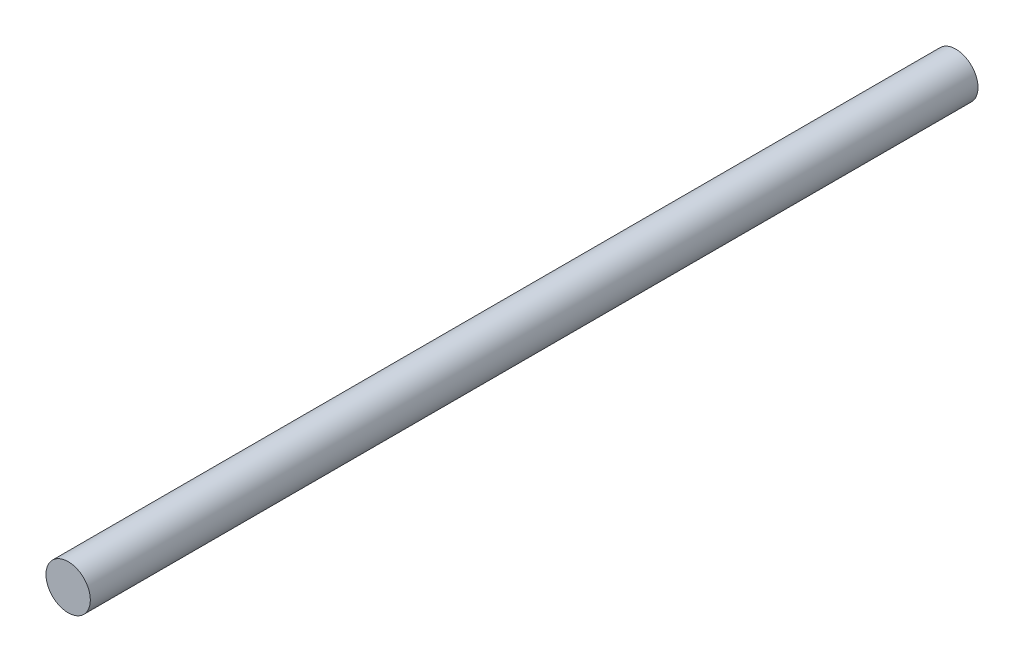
ISO-10303-21;
HEADER;
FILE_DESCRIPTION(('STEP AP214'),'2;1');
FILE_NAME('part.step','',(''),(''),'','','');
FILE_SCHEMA(('AUTOMOTIVE_DESIGN { 1 0 10303 214 1 1 1 1 }'));
ENDSEC;
DATA;
#1=APPLICATION_CONTEXT('core data for automotive mechanical design processes');
#2=APPLICATION_PROTOCOL_DEFINITION('international standard','automotive_design',2000,#1);
#3=PRODUCT_CONTEXT('',#1,'mechanical');
#4=PRODUCT('Part','Part','',(#3));
#5=PRODUCT_RELATED_PRODUCT_CATEGORY('part','',(#4));
#6=PRODUCT_DEFINITION_FORMATION('','',#4);
#7=PRODUCT_DEFINITION_CONTEXT('part definition',#1,'design');
#8=PRODUCT_DEFINITION('design','',#6,#7);
#9=PRODUCT_DEFINITION_SHAPE('','',#8);
#10=(LENGTH_UNIT() NAMED_UNIT(*) SI_UNIT(.MILLI.,.METRE.));
#11=(NAMED_UNIT(*) PLANE_ANGLE_UNIT() SI_UNIT($,.RADIAN.));
#12=(NAMED_UNIT(*) SI_UNIT($,.STERADIAN.) SOLID_ANGLE_UNIT());
#13=UNCERTAINTY_MEASURE_WITH_UNIT(LENGTH_MEASURE(1.E-05),#10,'distance_accuracy_value','');
#14=(GEOMETRIC_REPRESENTATION_CONTEXT(3) GLOBAL_UNCERTAINTY_ASSIGNED_CONTEXT((#13)) GLOBAL_UNIT_ASSIGNED_CONTEXT((#10,
#11,#12)) REPRESENTATION_CONTEXT('',''));
#15=CARTESIAN_POINT('',(0.,0.,0.));
#16=DIRECTION('',(0.,0.,1.));
#17=DIRECTION('',(1.,0.,0.));
#18=AXIS2_PLACEMENT_3D('',#15,#16,#17);
#19=CARTESIAN_POINT('',(0.,0.,0.));
#20=DIRECTION('',(0.,0.,1.));
#21=DIRECTION('',(1.,0.,0.));
#22=AXIS2_PLACEMENT_3D('',#19,#20,#21);
#23=CYLINDRICAL_SURFACE('',#22,4.00000000000002);
#24=CARTESIAN_POINT('',(0.,0.,0.));
#25=DIRECTION('',(0.,0.,1.));
#26=DIRECTION('',(1.,0.,0.));
#27=AXIS2_PLACEMENT_3D('',#24,#25,#26);
#28=CIRCLE('',#27,4.00000000000002);
#29=CARTESIAN_POINT('',(4.00000000000002,0.,0.));
#30=VERTEX_POINT('',#29);
#31=EDGE_CURVE('E10',#30,#30,#28,.T.);
#32=ORIENTED_EDGE('',*,*,#31,.T.);
#33=EDGE_LOOP('',(#32));
#34=FACE_BOUND('',#33,.T.);
#35=CARTESIAN_POINT('',(0.,0.,160.));
#36=DIRECTION('',(0.,0.,1.));
#37=DIRECTION('',(1.,0.,0.));
#38=AXIS2_PLACEMENT_3D('',#35,#36,#37);
#39=CIRCLE('',#38,4.00000000000002);
#40=CARTESIAN_POINT('',(4.00000000000002,0.,160.));
#41=VERTEX_POINT('',#40);
#42=EDGE_CURVE('E37',#41,#41,#39,.T.);
#43=ORIENTED_EDGE('',*,*,#42,.F.);
#44=EDGE_LOOP('',(#43));
#45=FACE_BOUND('',#44,.T.);
#46=ADVANCED_FACE('F31',(#34,#45),#23,.T.);
#47=CARTESIAN_POINT('',(4.00000000000002,0.,0.));
#48=DIRECTION('',(0.,0.,-1.));
#49=DIRECTION('',(-1.,0.,0.));
#50=AXIS2_PLACEMENT_3D('',#47,#48,#49);
#51=PLANE('',#50);
#52=ORIENTED_EDGE('',*,*,#31,.F.);
#53=EDGE_LOOP('',(#52));
#54=FACE_BOUND('',#53,.T.);
#55=ADVANCED_FACE('F46',(#54),#51,.T.);
#56=CARTESIAN_POINT('',(0.,0.,160.));
#57=DIRECTION('',(0.,0.,1.));
#58=DIRECTION('',(1.,0.,0.));
#59=AXIS2_PLACEMENT_3D('',#56,#57,#58);
#60=PLANE('',#59);
#61=ORIENTED_EDGE('',*,*,#42,.T.);
#62=EDGE_LOOP('',(#61));
#63=FACE_BOUND('',#62,.T.);
#64=ADVANCED_FACE('F43',(#63),#60,.T.);
#65=CLOSED_SHELL('',(#46,#55,#64));
#66=MANIFOLD_SOLID_BREP('B2',#65);
#67=ADVANCED_BREP_SHAPE_REPRESENTATION('',(#18,#66),#14);
#68=SHAPE_DEFINITION_REPRESENTATION(#9,#67);
ENDSEC;
END-ISO-10303-21;
